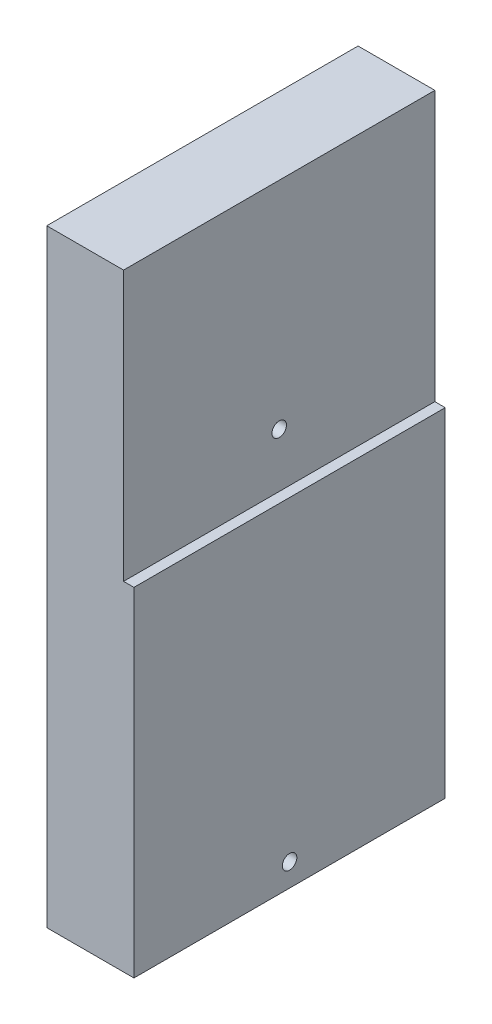
ISO-10303-21;
HEADER;
FILE_DESCRIPTION(('STEP AP214'),'2;1');
FILE_NAME('part.step','',(''),(''),'','','');
FILE_SCHEMA(('AUTOMOTIVE_DESIGN { 1 0 10303 214 1 1 1 1 }'));
ENDSEC;
DATA;
#1=APPLICATION_CONTEXT('core data for automotive mechanical design processes');
#2=APPLICATION_PROTOCOL_DEFINITION('international standard','automotive_design',2000,#1);
#3=PRODUCT_CONTEXT('',#1,'mechanical');
#4=PRODUCT('Part','Part','',(#3));
#5=PRODUCT_RELATED_PRODUCT_CATEGORY('part','',(#4));
#6=PRODUCT_DEFINITION_FORMATION('','',#4);
#7=PRODUCT_DEFINITION_CONTEXT('part definition',#1,'design');
#8=PRODUCT_DEFINITION('design','',#6,#7);
#9=PRODUCT_DEFINITION_SHAPE('','',#8);
#10=(LENGTH_UNIT() NAMED_UNIT(*) SI_UNIT(.MILLI.,.METRE.));
#11=(NAMED_UNIT(*) PLANE_ANGLE_UNIT() SI_UNIT($,.RADIAN.));
#12=(NAMED_UNIT(*) SI_UNIT($,.STERADIAN.) SOLID_ANGLE_UNIT());
#13=UNCERTAINTY_MEASURE_WITH_UNIT(LENGTH_MEASURE(1.E-05),#10,'distance_accuracy_value','');
#14=(GEOMETRIC_REPRESENTATION_CONTEXT(3) GLOBAL_UNCERTAINTY_ASSIGNED_CONTEXT((#13)) GLOBAL_UNIT_ASSIGNED_CONTEXT((#10,
#11,#12)) REPRESENTATION_CONTEXT('',''));
#15=CARTESIAN_POINT('',(0.,0.,0.));
#16=DIRECTION('',(0.,0.,1.));
#17=DIRECTION('',(1.,0.,0.));
#18=AXIS2_PLACEMENT_3D('',#15,#16,#17);
#19=CARTESIAN_POINT('',(0.,13.,75.));
#20=DIRECTION('',(0.,1.,0.));
#21=DIRECTION('',(0.,0.,1.));
#22=AXIS2_PLACEMENT_3D('',#19,#20,#21);
#23=PLANE('',#22);
#24=CARTESIAN_POINT('',(-9.49999999999999,13.,25.));
#25=DIRECTION('',(0.,-1.,0.));
#26=DIRECTION('',(0.,0.,-1.));
#27=AXIS2_PLACEMENT_3D('',#24,#25,#26);
#28=CIRCLE('',#27,2.1);
#29=CARTESIAN_POINT('',(-9.49999999999999,13.,22.9));
#30=VERTEX_POINT('',#29);
#31=EDGE_CURVE('E172',#30,#30,#28,.T.);
#32=ORIENTED_EDGE('',*,*,#31,.F.);
#33=EDGE_LOOP('',(#32));
#34=FACE_BOUND('',#33,.T.);
#35=CARTESIAN_POINT('',(-9.5,13.,50.));
#36=DIRECTION('',(0.,-1.,0.));
#37=DIRECTION('',(0.,0.,-1.));
#38=AXIS2_PLACEMENT_3D('',#35,#36,#37);
#39=CIRCLE('',#38,2.1);
#40=CARTESIAN_POINT('',(-9.5,13.,47.9));
#41=VERTEX_POINT('',#40);
#42=EDGE_CURVE('E175',#41,#41,#39,.T.);
#43=ORIENTED_EDGE('',*,*,#42,.F.);
#44=EDGE_LOOP('',(#43));
#45=FACE_BOUND('',#44,.T.);
#46=DIRECTION('',(1.,0.,0.));
#47=VECTOR('',#46,1.);
#48=CARTESIAN_POINT('',(0.,13.,0.));
#49=LINE('',#48,#47);
#50=CARTESIAN_POINT('',(-20.,13.,0.));
#51=VERTEX_POINT('',#50);
#52=CARTESIAN_POINT('',(1.,13.,0.));
#53=VERTEX_POINT('',#52);
#54=EDGE_CURVE('E82',#51,#53,#49,.T.);
#55=ORIENTED_EDGE('',*,*,#54,.T.);
#56=DIRECTION('',(0.,0.,-1.));
#57=VECTOR('',#56,1.);
#58=CARTESIAN_POINT('',(1.,13.,75.));
#59=LINE('',#58,#57);
#60=CARTESIAN_POINT('',(1.,13.,75.));
#61=VERTEX_POINT('',#60);
#62=EDGE_CURVE('E11',#61,#53,#59,.T.);
#63=ORIENTED_EDGE('',*,*,#62,.F.);
#64=DIRECTION('',(1.,0.,0.));
#65=VECTOR('',#64,1.);
#66=CARTESIAN_POINT('',(-20.,13.,75.));
#67=LINE('',#66,#65);
#68=CARTESIAN_POINT('',(-20.,13.,75.));
#69=VERTEX_POINT('',#68);
#70=EDGE_CURVE('E88',#69,#61,#67,.T.);
#71=ORIENTED_EDGE('',*,*,#70,.F.);
#72=DIRECTION('',(0.,0.,-1.));
#73=VECTOR('',#72,1.);
#74=CARTESIAN_POINT('',(-20.,13.,75.));
#75=LINE('',#74,#73);
#76=EDGE_CURVE('E116',#69,#51,#75,.T.);
#77=ORIENTED_EDGE('',*,*,#76,.T.);
#78=EDGE_LOOP('',(#55,#63,#71,#77));
#79=FACE_BOUND('',#78,.T.);
#80=ADVANCED_FACE('F34',(#34,#45,#79),#23,.F.);
#81=CARTESIAN_POINT('',(1.,13.,75.));
#82=DIRECTION('',(-1.,0.,0.));
#83=DIRECTION('',(0.,0.,1.));
#84=AXIS2_PLACEMENT_3D('',#81,#82,#83);
#85=PLANE('',#84);
#86=CARTESIAN_POINT('',(1.,18.5,37.5));
#87=DIRECTION('',(1.,0.,0.));
#88=DIRECTION('',(0.,0.,-1.));
#89=AXIS2_PLACEMENT_3D('',#86,#87,#88);
#90=CIRCLE('',#89,1.75);
#91=CARTESIAN_POINT('',(1.,18.5,35.75));
#92=VERTEX_POINT('',#91);
#93=EDGE_CURVE('E136',#92,#92,#90,.T.);
#94=ORIENTED_EDGE('',*,*,#93,.F.);
#95=EDGE_LOOP('',(#94));
#96=FACE_BOUND('',#95,.T.);
#97=DIRECTION('',(0.,1.,0.));
#98=VECTOR('',#97,1.);
#99=CARTESIAN_POINT('',(1.,13.,0.));
#100=LINE('',#99,#98);
#101=CARTESIAN_POINT('',(1.,94.5,0.));
#102=VERTEX_POINT('',#101);
#103=EDGE_CURVE('E121',#53,#102,#100,.T.);
#104=ORIENTED_EDGE('',*,*,#103,.T.);
#105=DIRECTION('',(0.,0.,-1.));
#106=VECTOR('',#105,1.);
#107=CARTESIAN_POINT('',(1.,94.5,75.));
#108=LINE('',#107,#106);
#109=CARTESIAN_POINT('',(1.,94.5,75.));
#110=VERTEX_POINT('',#109);
#111=EDGE_CURVE('E43',#110,#102,#108,.T.);
#112=ORIENTED_EDGE('',*,*,#111,.F.);
#113=DIRECTION('',(0.,1.,0.));
#114=VECTOR('',#113,1.);
#115=CARTESIAN_POINT('',(1.,13.,75.));
#116=LINE('',#115,#114);
#117=EDGE_CURVE('E149',#61,#110,#116,.T.);
#118=ORIENTED_EDGE('',*,*,#117,.F.);
#119=ORIENTED_EDGE('',*,*,#62,.T.);
#120=EDGE_LOOP('',(#104,#112,#118,#119));
#121=FACE_BOUND('',#120,.T.);
#122=ADVANCED_FACE('F153',(#96,#121),#85,.F.);
#123=CARTESIAN_POINT('',(1.,94.5,75.));
#124=DIRECTION('',(0.,-1.,0.));
#125=DIRECTION('',(0.,0.,-1.));
#126=AXIS2_PLACEMENT_3D('',#123,#124,#125);
#127=PLANE('',#126);
#128=DIRECTION('',(-1.,0.,0.));
#129=VECTOR('',#128,1.);
#130=CARTESIAN_POINT('',(1.,94.5,0.));
#131=LINE('',#130,#129);
#132=CARTESIAN_POINT('',(-1.5,94.5,0.));
#133=VERTEX_POINT('',#132);
#134=EDGE_CURVE('E124',#102,#133,#131,.T.);
#135=ORIENTED_EDGE('',*,*,#134,.T.);
#136=DIRECTION('',(0.,0.,-1.));
#137=VECTOR('',#136,1.);
#138=CARTESIAN_POINT('',(-1.5,94.5,75.));
#139=LINE('',#138,#137);
#140=CARTESIAN_POINT('',(-1.5,94.5,75.));
#141=VERTEX_POINT('',#140);
#142=EDGE_CURVE('E111',#141,#133,#139,.T.);
#143=ORIENTED_EDGE('',*,*,#142,.F.);
#144=DIRECTION('',(-1.,0.,0.));
#145=VECTOR('',#144,1.);
#146=CARTESIAN_POINT('',(1.,94.5,75.));
#147=LINE('',#146,#145);
#148=EDGE_CURVE('E102',#110,#141,#147,.T.);
#149=ORIENTED_EDGE('',*,*,#148,.F.);
#150=ORIENTED_EDGE('',*,*,#111,.T.);
#151=EDGE_LOOP('',(#135,#143,#149,#150));
#152=FACE_BOUND('',#151,.T.);
#153=ADVANCED_FACE('F156',(#152),#127,.F.);
#154=CARTESIAN_POINT('',(-1.5,94.5,75.));
#155=DIRECTION('',(-1.,0.,0.));
#156=DIRECTION('',(0.,0.,1.));
#157=AXIS2_PLACEMENT_3D('',#154,#155,#156);
#158=PLANE('',#157);
#159=CARTESIAN_POINT('',(-1.5,107.5,37.5));
#160=DIRECTION('',(1.,0.,0.));
#161=DIRECTION('',(0.,0.,-1.));
#162=AXIS2_PLACEMENT_3D('',#159,#160,#161);
#163=CIRCLE('',#162,1.75);
#164=CARTESIAN_POINT('',(-1.5,107.5,35.75));
#165=VERTEX_POINT('',#164);
#166=EDGE_CURVE('E144',#165,#165,#163,.T.);
#167=ORIENTED_EDGE('',*,*,#166,.F.);
#168=EDGE_LOOP('',(#167));
#169=FACE_BOUND('',#168,.T.);
#170=DIRECTION('',(0.,1.,0.));
#171=VECTOR('',#170,1.);
#172=CARTESIAN_POINT('',(-1.5,94.5,0.));
#173=LINE('',#172,#171);
#174=CARTESIAN_POINT('',(-1.5,159.45,0.));
#175=VERTEX_POINT('',#174);
#176=EDGE_CURVE('E110',#133,#175,#173,.T.);
#177=ORIENTED_EDGE('',*,*,#176,.T.);
#178=DIRECTION('',(0.,0.,-1.));
#179=VECTOR('',#178,1.);
#180=CARTESIAN_POINT('',(-1.5,159.45,75.));
#181=LINE('',#180,#179);
#182=CARTESIAN_POINT('',(-1.5,159.45,75.));
#183=VERTEX_POINT('',#182);
#184=EDGE_CURVE('E107',#183,#175,#181,.T.);
#185=ORIENTED_EDGE('',*,*,#184,.F.);
#186=DIRECTION('',(0.,1.,0.));
#187=VECTOR('',#186,1.);
#188=CARTESIAN_POINT('',(-1.5,94.5,75.));
#189=LINE('',#188,#187);
#190=EDGE_CURVE('E96',#141,#183,#189,.T.);
#191=ORIENTED_EDGE('',*,*,#190,.F.);
#192=ORIENTED_EDGE('',*,*,#142,.T.);
#193=EDGE_LOOP('',(#177,#185,#191,#192));
#194=FACE_BOUND('',#193,.T.);
#195=ADVANCED_FACE('F108',(#169,#194),#158,.F.);
#196=CARTESIAN_POINT('',(-1.5,159.45,75.));
#197=DIRECTION('',(0.,-1.,0.));
#198=DIRECTION('',(0.,0.,-1.));
#199=AXIS2_PLACEMENT_3D('',#196,#197,#198);
#200=PLANE('',#199);
#201=DIRECTION('',(-1.,0.,0.));
#202=VECTOR('',#201,1.);
#203=CARTESIAN_POINT('',(-1.5,159.45,0.));
#204=LINE('',#203,#202);
#205=CARTESIAN_POINT('',(-20.,159.45,0.));
#206=VERTEX_POINT('',#205);
#207=EDGE_CURVE('E75',#175,#206,#204,.T.);
#208=ORIENTED_EDGE('',*,*,#207,.T.);
#209=DIRECTION('',(0.,0.,-1.));
#210=VECTOR('',#209,1.);
#211=CARTESIAN_POINT('',(-20.,159.45,75.));
#212=LINE('',#211,#210);
#213=CARTESIAN_POINT('',(-20.,159.45,75.));
#214=VERTEX_POINT('',#213);
#215=EDGE_CURVE('E112',#214,#206,#212,.T.);
#216=ORIENTED_EDGE('',*,*,#215,.F.);
#217=DIRECTION('',(-1.,0.,0.));
#218=VECTOR('',#217,1.);
#219=CARTESIAN_POINT('',(-1.5,159.45,75.));
#220=LINE('',#219,#218);
#221=EDGE_CURVE('E100',#183,#214,#220,.T.);
#222=ORIENTED_EDGE('',*,*,#221,.F.);
#223=ORIENTED_EDGE('',*,*,#184,.T.);
#224=EDGE_LOOP('',(#208,#216,#222,#223));
#225=FACE_BOUND('',#224,.T.);
#226=ADVANCED_FACE('F114',(#225),#200,.F.);
#227=CARTESIAN_POINT('',(-20.,159.45,75.));
#228=DIRECTION('',(1.,0.,0.));
#229=DIRECTION('',(0.,0.,-1.));
#230=AXIS2_PLACEMENT_3D('',#227,#228,#229);
#231=PLANE('',#230);
#232=CARTESIAN_POINT('',(-20.,107.5,37.5));
#233=DIRECTION('',(1.,0.,0.));
#234=DIRECTION('',(0.,0.,-1.));
#235=AXIS2_PLACEMENT_3D('',#232,#233,#234);
#236=CIRCLE('',#235,1.75);
#237=CARTESIAN_POINT('',(-20.,107.5,35.75));
#238=VERTEX_POINT('',#237);
#239=EDGE_CURVE('E37',#238,#238,#236,.T.);
#240=ORIENTED_EDGE('',*,*,#239,.T.);
#241=EDGE_LOOP('',(#240));
#242=FACE_BOUND('',#241,.T.);
#243=CARTESIAN_POINT('',(-20.,18.5,37.5));
#244=DIRECTION('',(1.,0.,0.));
#245=DIRECTION('',(0.,0.,-1.));
#246=AXIS2_PLACEMENT_3D('',#243,#244,#245);
#247=CIRCLE('',#246,1.75);
#248=CARTESIAN_POINT('',(-20.,18.5,35.75));
#249=VERTEX_POINT('',#248);
#250=EDGE_CURVE('E122',#249,#249,#247,.T.);
#251=ORIENTED_EDGE('',*,*,#250,.T.);
#252=EDGE_LOOP('',(#251));
#253=FACE_BOUND('',#252,.T.);
#254=DIRECTION('',(0.,-1.,0.));
#255=VECTOR('',#254,1.);
#256=CARTESIAN_POINT('',(-20.,159.45,0.));
#257=LINE('',#256,#255);
#258=EDGE_CURVE('E128',#206,#51,#257,.T.);
#259=ORIENTED_EDGE('',*,*,#258,.T.);
#260=ORIENTED_EDGE('',*,*,#76,.F.);
#261=DIRECTION('',(0.,-1.,0.));
#262=VECTOR('',#261,1.);
#263=CARTESIAN_POINT('',(-20.,159.45,75.));
#264=LINE('',#263,#262);
#265=EDGE_CURVE('E52',#214,#69,#264,.T.);
#266=ORIENTED_EDGE('',*,*,#265,.F.);
#267=ORIENTED_EDGE('',*,*,#215,.T.);
#268=EDGE_LOOP('',(#259,#260,#266,#267));
#269=FACE_BOUND('',#268,.T.);
#270=ADVANCED_FACE('F159',(#242,#253,#269),#231,.F.);
#271=CARTESIAN_POINT('',(0.,0.,75.));
#272=DIRECTION('',(0.,0.,1.));
#273=DIRECTION('',(1.,0.,0.));
#274=AXIS2_PLACEMENT_3D('',#271,#272,#273);
#275=PLANE('',#274);
#276=ORIENTED_EDGE('',*,*,#70,.T.);
#277=ORIENTED_EDGE('',*,*,#117,.T.);
#278=ORIENTED_EDGE('',*,*,#148,.T.);
#279=ORIENTED_EDGE('',*,*,#190,.T.);
#280=ORIENTED_EDGE('',*,*,#221,.T.);
#281=ORIENTED_EDGE('',*,*,#265,.T.);
#282=EDGE_LOOP('',(#276,#277,#278,#279,#280,#281));
#283=FACE_BOUND('',#282,.T.);
#284=ADVANCED_FACE('F98',(#283),#275,.T.);
#285=CARTESIAN_POINT('',(0.,0.,0.));
#286=DIRECTION('',(0.,0.,1.));
#287=DIRECTION('',(1.,0.,0.));
#288=AXIS2_PLACEMENT_3D('',#285,#286,#287);
#289=PLANE('',#288);
#290=ORIENTED_EDGE('',*,*,#54,.F.);
#291=ORIENTED_EDGE('',*,*,#258,.F.);
#292=ORIENTED_EDGE('',*,*,#207,.F.);
#293=ORIENTED_EDGE('',*,*,#176,.F.);
#294=ORIENTED_EDGE('',*,*,#134,.F.);
#295=ORIENTED_EDGE('',*,*,#103,.F.);
#296=EDGE_LOOP('',(#290,#291,#292,#293,#294,#295));
#297=FACE_BOUND('',#296,.T.);
#298=ADVANCED_FACE('F157',(#297),#289,.F.);
#299=CARTESIAN_POINT('',(-24.,18.5,37.5));
#300=DIRECTION('',(1.,0.,0.));
#301=DIRECTION('',(0.,0.,-1.));
#302=AXIS2_PLACEMENT_3D('',#299,#300,#301);
#303=CYLINDRICAL_SURFACE('',#302,1.75);
#304=ORIENTED_EDGE('',*,*,#93,.T.);
#305=EDGE_LOOP('',(#304));
#306=FACE_BOUND('',#305,.T.);
#307=ORIENTED_EDGE('',*,*,#250,.F.);
#308=EDGE_LOOP('',(#307));
#309=FACE_BOUND('',#308,.T.);
#310=ADVANCED_FACE('F208',(#306,#309),#303,.F.);
#311=CARTESIAN_POINT('',(-26.5,107.5,37.5));
#312=DIRECTION('',(1.,0.,0.));
#313=DIRECTION('',(0.,0.,-1.));
#314=AXIS2_PLACEMENT_3D('',#311,#312,#313);
#315=CYLINDRICAL_SURFACE('',#314,1.75);
#316=ORIENTED_EDGE('',*,*,#166,.T.);
#317=EDGE_LOOP('',(#316));
#318=FACE_BOUND('',#317,.T.);
#319=ORIENTED_EDGE('',*,*,#239,.F.);
#320=EDGE_LOOP('',(#319));
#321=FACE_BOUND('',#320,.T.);
#322=ADVANCED_FACE('F204',(#318,#321),#315,.F.);
#323=CARTESIAN_POINT('',(-9.5,23.,50.));
#324=DIRECTION('',(0.,-1.,0.));
#325=DIRECTION('',(0.,0.,-1.));
#326=AXIS2_PLACEMENT_3D('',#323,#324,#325);
#327=CYLINDRICAL_SURFACE('',#326,2.1);
#328=CARTESIAN_POINT('',(-9.5,23.,50.));
#329=DIRECTION('',(0.,-1.,0.));
#330=DIRECTION('',(0.,0.,-1.));
#331=AXIS2_PLACEMENT_3D('',#328,#329,#330);
#332=CIRCLE('',#331,2.1);
#333=CARTESIAN_POINT('',(-9.5,23.,47.9));
#334=VERTEX_POINT('',#333);
#335=EDGE_CURVE('E177',#334,#334,#332,.T.);
#336=ORIENTED_EDGE('',*,*,#335,.F.);
#337=EDGE_LOOP('',(#336));
#338=FACE_BOUND('',#337,.T.);
#339=ORIENTED_EDGE('',*,*,#42,.T.);
#340=EDGE_LOOP('',(#339));
#341=FACE_BOUND('',#340,.T.);
#342=ADVANCED_FACE('F197',(#338,#341),#327,.F.);
#343=CARTESIAN_POINT('',(-9.5,23.,50.));
#344=DIRECTION('',(0.,-1.,0.));
#345=DIRECTION('',(0.,0.,-1.));
#346=AXIS2_PLACEMENT_3D('',#343,#344,#345);
#347=PLANE('',#346);
#348=ORIENTED_EDGE('',*,*,#335,.T.);
#349=EDGE_LOOP('',(#348));
#350=FACE_BOUND('',#349,.T.);
#351=ADVANCED_FACE('F188',(#350),#347,.T.);
#352=CARTESIAN_POINT('',(-9.49999999999999,23.,25.));
#353=DIRECTION('',(0.,-1.,0.));
#354=DIRECTION('',(0.,0.,-1.));
#355=AXIS2_PLACEMENT_3D('',#352,#353,#354);
#356=CYLINDRICAL_SURFACE('',#355,2.1);
#357=CARTESIAN_POINT('',(-9.49999999999999,23.,25.));
#358=DIRECTION('',(0.,-1.,0.));
#359=DIRECTION('',(0.,0.,-1.));
#360=AXIS2_PLACEMENT_3D('',#357,#358,#359);
#361=CIRCLE('',#360,2.1);
#362=CARTESIAN_POINT('',(-9.49999999999999,23.,22.9));
#363=VERTEX_POINT('',#362);
#364=EDGE_CURVE('E178',#363,#363,#361,.T.);
#365=ORIENTED_EDGE('',*,*,#364,.F.);
#366=EDGE_LOOP('',(#365));
#367=FACE_BOUND('',#366,.T.);
#368=ORIENTED_EDGE('',*,*,#31,.T.);
#369=EDGE_LOOP('',(#368));
#370=FACE_BOUND('',#369,.T.);
#371=ADVANCED_FACE('F185',(#367,#370),#356,.F.);
#372=CARTESIAN_POINT('',(-9.49999999999999,23.,25.));
#373=DIRECTION('',(0.,-1.,0.));
#374=DIRECTION('',(0.,0.,-1.));
#375=AXIS2_PLACEMENT_3D('',#372,#373,#374);
#376=PLANE('',#375);
#377=ORIENTED_EDGE('',*,*,#364,.T.);
#378=EDGE_LOOP('',(#377));
#379=FACE_BOUND('',#378,.T.);
#380=ADVANCED_FACE('F187',(#379),#376,.T.);
#381=CLOSED_SHELL('',(#80,#122,#153,#195,#226,#270,#284,#298,#310,#322,#342,#351,#371,#380));
#382=MANIFOLD_SOLID_BREP('B2',#381);
#383=ADVANCED_BREP_SHAPE_REPRESENTATION('',(#18,#382),#14);
#384=SHAPE_DEFINITION_REPRESENTATION(#9,#383);
ENDSEC;
END-ISO-10303-21;
